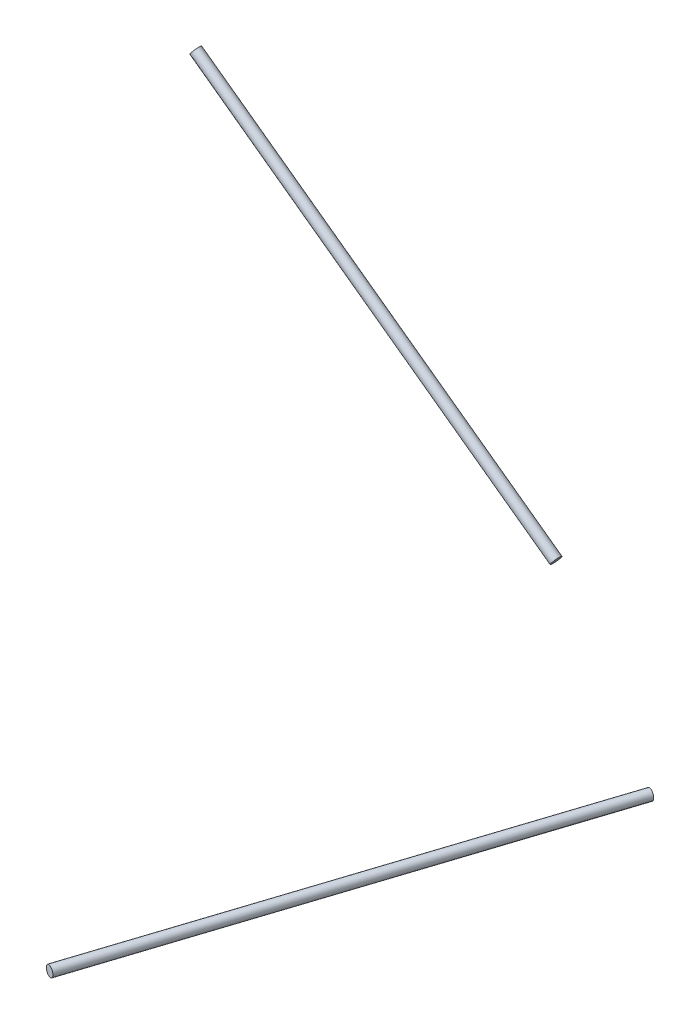
ISO-10303-21;
HEADER;
FILE_DESCRIPTION(('STEP AP214'),'2;1');
FILE_NAME('part.step','',(''),(''),'','','');
FILE_SCHEMA(('AUTOMOTIVE_DESIGN { 1 0 10303 214 1 1 1 1 }'));
ENDSEC;
DATA;
#1=APPLICATION_CONTEXT('core data for automotive mechanical design processes');
#2=APPLICATION_PROTOCOL_DEFINITION('international standard','automotive_design',2000,#1);
#3=PRODUCT_CONTEXT('',#1,'mechanical');
#4=PRODUCT('Part','Part','',(#3));
#5=PRODUCT_RELATED_PRODUCT_CATEGORY('part','',(#4));
#6=PRODUCT_DEFINITION_FORMATION('','',#4);
#7=PRODUCT_DEFINITION_CONTEXT('part definition',#1,'design');
#8=PRODUCT_DEFINITION('design','',#6,#7);
#9=PRODUCT_DEFINITION_SHAPE('','',#8);
#10=(LENGTH_UNIT() NAMED_UNIT(*) SI_UNIT(.MILLI.,.METRE.));
#11=(NAMED_UNIT(*) PLANE_ANGLE_UNIT() SI_UNIT($,.RADIAN.));
#12=(NAMED_UNIT(*) SI_UNIT($,.STERADIAN.) SOLID_ANGLE_UNIT());
#13=UNCERTAINTY_MEASURE_WITH_UNIT(LENGTH_MEASURE(1.E-05),#10,'distance_accuracy_value','');
#14=(GEOMETRIC_REPRESENTATION_CONTEXT(3) GLOBAL_UNCERTAINTY_ASSIGNED_CONTEXT((#13)) GLOBAL_UNIT_ASSIGNED_CONTEXT((#10,
#11,#12)) REPRESENTATION_CONTEXT('',''));
#15=CARTESIAN_POINT('',(0.,0.,0.));
#16=DIRECTION('',(0.,0.,1.));
#17=DIRECTION('',(1.,0.,0.));
#18=AXIS2_PLACEMENT_3D('',#15,#16,#17);
#19=CARTESIAN_POINT('',(74.3249683997209,0.,44.5903652225247));
#20=DIRECTION('',(0.309016994374937,0.,-0.951056516295157));
#21=DIRECTION('',(-0.951056516295157,0.,-0.309016994374937));
#22=AXIS2_PLACEMENT_3D('',#19,#20,#21);
#23=PLANE('',#22);
#24=CARTESIAN_POINT('',(74.3249683997209,0.,44.5903652225247));
#25=DIRECTION('',(0.309016994374937,0.,-0.951056516295157));
#26=DIRECTION('',(-0.951056516295157,0.,-0.309016994374937));
#27=AXIS2_PLACEMENT_3D('',#24,#25,#26);
#28=CIRCLE('',#27,1.49999999999999);
#29=CARTESIAN_POINT('',(72.8983836252782,0.,44.1268397309623));
#30=VERTEX_POINT('',#29);
#31=EDGE_CURVE('E46',#30,#30,#28,.T.);
#32=ORIENTED_EDGE('',*,*,#31,.F.);
#33=EDGE_LOOP('',(#32));
#34=FACE_BOUND('',#33,.T.);
#35=ADVANCED_FACE('F40',(#34),#23,.F.);
#36=CARTESIAN_POINT('',(117.688753794732,0.,-88.8696431973082));
#37=DIRECTION('',(0.309016994374937,0.,-0.951056516295157));
#38=DIRECTION('',(-0.951056516295157,0.,-0.309016994374937));
#39=AXIS2_PLACEMENT_3D('',#36,#37,#38);
#40=PLANE('',#39);
#41=CARTESIAN_POINT('',(117.688753794732,0.,-88.8696431973082));
#42=DIRECTION('',(0.309016994374937,0.,-0.951056516295157));
#43=DIRECTION('',(-0.951056516295157,0.,-0.309016994374937));
#44=AXIS2_PLACEMENT_3D('',#41,#42,#43);
#45=CIRCLE('',#44,1.49999999999999);
#46=CARTESIAN_POINT('',(116.26216902029,0.,-89.3331686888706));
#47=VERTEX_POINT('',#46);
#48=EDGE_CURVE('E11',#47,#47,#45,.T.);
#49=ORIENTED_EDGE('',*,*,#48,.T.);
#50=EDGE_LOOP('',(#49));
#51=FACE_BOUND('',#50,.T.);
#52=ADVANCED_FACE('F55',(#51),#40,.T.);
#53=CARTESIAN_POINT('',(74.3249683997209,0.,44.5903652225247));
#54=DIRECTION('',(0.309016994374937,0.,-0.951056516295157));
#55=DIRECTION('',(-0.951056516295157,0.,-0.309016994374937));
#56=AXIS2_PLACEMENT_3D('',#53,#54,#55);
#57=CYLINDRICAL_SURFACE('',#56,1.49999999999999);
#58=ORIENTED_EDGE('',*,*,#48,.F.);
#59=EDGE_LOOP('',(#58));
#60=FACE_BOUND('',#59,.T.);
#61=ORIENTED_EDGE('',*,*,#31,.T.);
#62=EDGE_LOOP('',(#61));
#63=FACE_BOUND('',#62,.T.);
#64=ADVANCED_FACE('F52',(#60,#63),#57,.T.);
#65=CLOSED_SHELL('',(#35,#52,#64));
#66=MANIFOLD_SOLID_BREP('B2',#65);
#67=CARTESIAN_POINT('',(178.792755756863,134.602822774976,0.));
#68=DIRECTION('',(-0.809016994374947,0.587785252292474,0.));
#69=DIRECTION('',(-0.587785252292474,-0.809016994374947,0.));
#70=AXIS2_PLACEMENT_3D('',#67,#68,#69);
#71=PLANE('',#70);
#72=CARTESIAN_POINT('',(178.792755756863,134.602822774976,0.));
#73=DIRECTION('',(-0.809016994374947,0.587785252292474,0.));
#74=DIRECTION('',(-0.587785252292474,-0.809016994374947,0.));
#75=AXIS2_PLACEMENT_3D('',#72,#73,#74);
#76=CIRCLE('',#75,1.5);
#77=CARTESIAN_POINT('',(177.911077878425,133.389297283414,0.));
#78=VERTEX_POINT('',#77);
#79=EDGE_CURVE('E86',#78,#78,#76,.T.);
#80=ORIENTED_EDGE('',*,*,#79,.F.);
#81=EDGE_LOOP('',(#80));
#82=FACE_BOUND('',#81,.T.);
#83=ADVANCED_FACE('F80',(#82),#71,.F.);
#84=CARTESIAN_POINT('',(72.764891711863,211.63657515724,0.));
#85=DIRECTION('',(-0.809016994374947,0.587785252292474,0.));
#86=DIRECTION('',(-0.587785252292474,-0.809016994374947,0.));
#87=AXIS2_PLACEMENT_3D('',#84,#85,#86);
#88=PLANE('',#87);
#89=CARTESIAN_POINT('',(72.764891711863,211.63657515724,0.));
#90=DIRECTION('',(-0.809016994374947,0.587785252292474,0.));
#91=DIRECTION('',(-0.587785252292474,-0.809016994374947,0.));
#92=AXIS2_PLACEMENT_3D('',#89,#90,#91);
#93=CIRCLE('',#92,1.5);
#94=CARTESIAN_POINT('',(71.8832138334243,210.423049665677,0.));
#95=VERTEX_POINT('',#94);
#96=EDGE_CURVE('E39',#95,#95,#93,.T.);
#97=ORIENTED_EDGE('',*,*,#96,.T.);
#98=EDGE_LOOP('',(#97));
#99=FACE_BOUND('',#98,.T.);
#100=ADVANCED_FACE('F95',(#99),#88,.T.);
#101=CARTESIAN_POINT('',(178.792755756863,134.602822774976,0.));
#102=DIRECTION('',(-0.809016994374948,0.587785252292473,0.));
#103=DIRECTION('',(-0.587785252292473,-0.809016994374948,0.));
#104=AXIS2_PLACEMENT_3D('',#101,#102,#103);
#105=CYLINDRICAL_SURFACE('',#104,1.5);
#106=ORIENTED_EDGE('',*,*,#96,.F.);
#107=EDGE_LOOP('',(#106));
#108=FACE_BOUND('',#107,.T.);
#109=ORIENTED_EDGE('',*,*,#79,.T.);
#110=EDGE_LOOP('',(#109));
#111=FACE_BOUND('',#110,.T.);
#112=ADVANCED_FACE('F92',(#108,#111),#105,.T.);
#113=CLOSED_SHELL('',(#83,#100,#112));
#114=MANIFOLD_SOLID_BREP('B6_NOT_SHOWN',#113);
#115=ADVANCED_BREP_SHAPE_REPRESENTATION('',(#18,#66,#114),#14);
#116=SHAPE_DEFINITION_REPRESENTATION(#9,#115);
ENDSEC;
END-ISO-10303-21;
